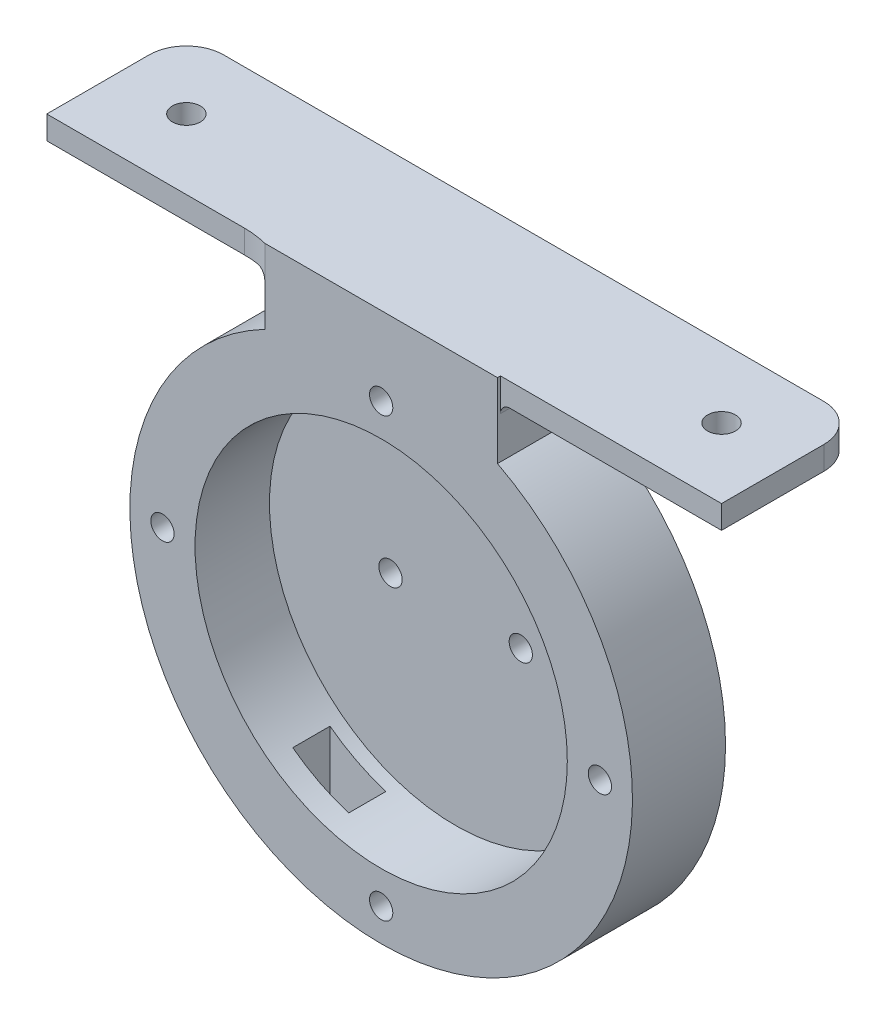
ISO-10303-21;
HEADER;
FILE_DESCRIPTION(('STEP AP214'),'2;1');
FILE_NAME('part.step','',(''),(''),'','','');
FILE_SCHEMA(('AUTOMOTIVE_DESIGN { 1 0 10303 214 1 1 1 1 }'));
ENDSEC;
DATA;
#1=APPLICATION_CONTEXT('core data for automotive mechanical design processes');
#2=APPLICATION_PROTOCOL_DEFINITION('international standard','automotive_design',2000,#1);
#3=PRODUCT_CONTEXT('',#1,'mechanical');
#4=PRODUCT('Part','Part','',(#3));
#5=PRODUCT_RELATED_PRODUCT_CATEGORY('part','',(#4));
#6=PRODUCT_DEFINITION_FORMATION('','',#4);
#7=PRODUCT_DEFINITION_CONTEXT('part definition',#1,'design');
#8=PRODUCT_DEFINITION('design','',#6,#7);
#9=PRODUCT_DEFINITION_SHAPE('','',#8);
#10=(LENGTH_UNIT() NAMED_UNIT(*) SI_UNIT(.MILLI.,.METRE.));
#11=(NAMED_UNIT(*) PLANE_ANGLE_UNIT() SI_UNIT($,.RADIAN.));
#12=(NAMED_UNIT(*) SI_UNIT($,.STERADIAN.) SOLID_ANGLE_UNIT());
#13=UNCERTAINTY_MEASURE_WITH_UNIT(LENGTH_MEASURE(1.E-05),#10,'distance_accuracy_value','');
#14=(GEOMETRIC_REPRESENTATION_CONTEXT(3) GLOBAL_UNCERTAINTY_ASSIGNED_CONTEXT((#13)) GLOBAL_UNIT_ASSIGNED_CONTEXT((#10,
#11,#12)) REPRESENTATION_CONTEXT('',''));
#15=CARTESIAN_POINT('',(0.,0.,0.));
#16=DIRECTION('',(0.,0.,1.));
#17=DIRECTION('',(1.,0.,0.));
#18=AXIS2_PLACEMENT_3D('',#15,#16,#17);
#19=CARTESIAN_POINT('',(-12.5,23.9321958875486,4.));
#20=DIRECTION('',(-1.,0.,0.));
#21=DIRECTION('',(0.,0.,1.));
#22=AXIS2_PLACEMENT_3D('',#19,#20,#21);
#23=PLANE('',#22);
#24=DIRECTION('',(0.,-1.,0.));
#25=VECTOR('',#24,1.);
#26=CARTESIAN_POINT('',(-12.5,23.9321958875486,10.));
#27=LINE('',#26,#25);
#28=CARTESIAN_POINT('',(-12.5,28.4321958875486,10.));
#29=VERTEX_POINT('',#28);
#30=CARTESIAN_POINT('',(-12.5,23.9321958875486,10.));
#31=VERTEX_POINT('',#30);
#32=EDGE_CURVE('E255',#29,#31,#27,.T.);
#33=ORIENTED_EDGE('',*,*,#32,.F.);
#34=DIRECTION('',(0.,0.,1.));
#35=VECTOR('',#34,1.);
#36=CARTESIAN_POINT('',(-12.5,28.4321958875486,4.));
#37=LINE('',#36,#35);
#38=CARTESIAN_POINT('',(-12.5,28.4321958875486,4.));
#39=VERTEX_POINT('',#38);
#40=EDGE_CURVE('E66',#29,#39,#37,.F.);
#41=ORIENTED_EDGE('',*,*,#40,.T.);
#42=DIRECTION('',(0.,-1.,0.));
#43=VECTOR('',#42,1.);
#44=CARTESIAN_POINT('',(-12.5,23.9321958875486,4.));
#45=LINE('',#44,#43);
#46=CARTESIAN_POINT('',(-12.5,23.9321958875486,4.));
#47=VERTEX_POINT('',#46);
#48=EDGE_CURVE('E275',#39,#47,#45,.T.);
#49=ORIENTED_EDGE('',*,*,#48,.T.);
#50=DIRECTION('',(0.,0.,1.));
#51=VECTOR('',#50,1.);
#52=CARTESIAN_POINT('',(-12.5,23.9321958875486,4.));
#53=LINE('',#52,#51);
#54=EDGE_CURVE('E281',#47,#31,#53,.T.);
#55=ORIENTED_EDGE('',*,*,#54,.T.);
#56=EDGE_LOOP('',(#33,#41,#49,#55));
#57=FACE_BOUND('',#56,.T.);
#58=ADVANCED_FACE('F41',(#57),#23,.T.);
#59=CARTESIAN_POINT('',(0.,0.,10.));
#60=DIRECTION('',(0.,0.,1.));
#61=DIRECTION('',(1.,0.,0.));
#62=AXIS2_PLACEMENT_3D('',#59,#60,#61);
#63=PLANE('',#62);
#64=DIRECTION('',(0.,1.,0.));
#65=VECTOR('',#64,1.);
#66=CARTESIAN_POINT('',(12.5,23.9321958875486,10.));
#67=LINE('',#66,#65);
#68=CARTESIAN_POINT('',(12.5,23.9321958875486,10.));
#69=VERTEX_POINT('',#68);
#70=CARTESIAN_POINT('',(12.5,31.9321958875486,10.));
#71=VERTEX_POINT('',#70);
#72=EDGE_CURVE('E283',#69,#71,#67,.T.);
#73=ORIENTED_EDGE('',*,*,#72,.T.);
#74=DIRECTION('',(-1.,0.,0.));
#75=VECTOR('',#74,1.);
#76=CARTESIAN_POINT('',(-12.5,31.9321958875486,10.));
#77=LINE('',#76,#75);
#78=CARTESIAN_POINT('',(-12.5,31.9321958875486,10.));
#79=VERTEX_POINT('',#78);
#80=EDGE_CURVE('E278',#71,#79,#77,.T.);
#81=ORIENTED_EDGE('',*,*,#80,.T.);
#82=EDGE_CURVE('E59',#79,#29,#27,.T.);
#83=ORIENTED_EDGE('',*,*,#82,.T.);
#84=ORIENTED_EDGE('',*,*,#32,.T.);
#85=CARTESIAN_POINT('',(0.,0.,10.));
#86=DIRECTION('',(0.,0.,1.));
#87=DIRECTION('',(1.,0.,0.));
#88=AXIS2_PLACEMENT_3D('',#85,#86,#87);
#89=CIRCLE('',#88,27.);
#90=EDGE_CURVE('E334',#31,#69,#89,.T.);
#91=ORIENTED_EDGE('',*,*,#90,.T.);
#92=EDGE_LOOP('',(#73,#81,#83,#84,#91));
#93=FACE_BOUND('',#92,.T.);
#94=CARTESIAN_POINT('',(1.327186583295E-12,-23.5,10.));
#95=DIRECTION('',(0.,0.,1.));
#96=DIRECTION('',(1.,0.,0.));
#97=AXIS2_PLACEMENT_3D('',#94,#95,#96);
#98=CIRCLE('',#97,1.25000000000143);
#99=CARTESIAN_POINT('',(1.25000000000276,-23.5,10.));
#100=VERTEX_POINT('',#99);
#101=EDGE_CURVE('E313',#100,#100,#98,.T.);
#102=ORIENTED_EDGE('',*,*,#101,.F.);
#103=EDGE_LOOP('',(#102));
#104=FACE_BOUND('',#103,.T.);
#105=CARTESIAN_POINT('',(0.,0.,10.));
#106=DIRECTION('',(0.,0.,1.));
#107=DIRECTION('',(1.,0.,0.));
#108=AXIS2_PLACEMENT_3D('',#105,#106,#107);
#109=CIRCLE('',#108,20.);
#110=CARTESIAN_POINT('',(20.,0.,10.));
#111=VERTEX_POINT('',#110);
#112=EDGE_CURVE('E322',#111,#111,#109,.T.);
#113=ORIENTED_EDGE('',*,*,#112,.F.);
#114=EDGE_LOOP('',(#113));
#115=FACE_BOUND('',#114,.T.);
#116=CARTESIAN_POINT('',(0.,23.5,10.));
#117=DIRECTION('',(0.,0.,1.));
#118=DIRECTION('',(1.,0.,0.));
#119=AXIS2_PLACEMENT_3D('',#116,#117,#118);
#120=CIRCLE('',#119,1.25);
#121=CARTESIAN_POINT('',(1.25,23.5,10.));
#122=VERTEX_POINT('',#121);
#123=EDGE_CURVE('E328',#122,#122,#120,.T.);
#124=ORIENTED_EDGE('',*,*,#123,.F.);
#125=EDGE_LOOP('',(#124));
#126=FACE_BOUND('',#125,.T.);
#127=CARTESIAN_POINT('',(23.5000000000007,6.635932916475E-13,10.));
#128=DIRECTION('',(0.,0.,1.));
#129=DIRECTION('',(1.,0.,0.));
#130=AXIS2_PLACEMENT_3D('',#127,#128,#129);
#131=CIRCLE('',#130,1.25000000000052);
#132=CARTESIAN_POINT('',(24.7500000000012,6.635932916475E-13,10.));
#133=VERTEX_POINT('',#132);
#134=EDGE_CURVE('E319',#133,#133,#131,.T.);
#135=ORIENTED_EDGE('',*,*,#134,.F.);
#136=EDGE_LOOP('',(#135));
#137=FACE_BOUND('',#136,.T.);
#138=CARTESIAN_POINT('',(-23.4999999999993,-6.66471211625496E-13,10.));
#139=DIRECTION('',(0.,0.,1.));
#140=DIRECTION('',(1.,0.,0.));
#141=AXIS2_PLACEMENT_3D('',#138,#139,#140);
#142=CIRCLE('',#141,1.25000000000107);
#143=CARTESIAN_POINT('',(-22.2499999999983,-6.66471211625496E-13,10.));
#144=VERTEX_POINT('',#143);
#145=EDGE_CURVE('E307',#144,#144,#142,.T.);
#146=ORIENTED_EDGE('',*,*,#145,.F.);
#147=EDGE_LOOP('',(#146));
#148=FACE_BOUND('',#147,.T.);
#149=ADVANCED_FACE('F401',(#93,#104,#115,#126,#137,#148),#63,.T.);
#150=CARTESIAN_POINT('',(0.,0.,0.));
#151=DIRECTION('',(0.,0.,1.));
#152=DIRECTION('',(1.,0.,0.));
#153=AXIS2_PLACEMENT_3D('',#150,#151,#152);
#154=PLANE('',#153);
#155=CARTESIAN_POINT('',(0.,0.,0.));
#156=DIRECTION('',(0.,0.,1.));
#157=DIRECTION('',(1.,0.,0.));
#158=AXIS2_PLACEMENT_3D('',#155,#156,#157);
#159=CIRCLE('',#158,27.);
#160=CARTESIAN_POINT('',(27.,0.,0.));
#161=VERTEX_POINT('',#160);
#162=EDGE_CURVE('E331',#161,#161,#159,.T.);
#163=ORIENTED_EDGE('',*,*,#162,.F.);
#164=EDGE_LOOP('',(#163));
#165=FACE_BOUND('',#164,.T.);
#166=CARTESIAN_POINT('',(0.,23.5,0.));
#167=DIRECTION('',(0.,0.,1.));
#168=DIRECTION('',(1.,0.,0.));
#169=AXIS2_PLACEMENT_3D('',#166,#167,#168);
#170=CIRCLE('',#169,1.25);
#171=CARTESIAN_POINT('',(1.25,23.5,0.));
#172=VERTEX_POINT('',#171);
#173=EDGE_CURVE('E327',#172,#172,#170,.T.);
#174=ORIENTED_EDGE('',*,*,#173,.T.);
#175=EDGE_LOOP('',(#174));
#176=FACE_BOUND('',#175,.T.);
#177=CARTESIAN_POINT('',(23.5000000000007,6.635932916475E-13,0.));
#178=DIRECTION('',(0.,0.,1.));
#179=DIRECTION('',(1.,0.,0.));
#180=AXIS2_PLACEMENT_3D('',#177,#178,#179);
#181=CIRCLE('',#180,1.25000000000052);
#182=CARTESIAN_POINT('',(24.7500000000012,6.635932916475E-13,0.));
#183=VERTEX_POINT('',#182);
#184=EDGE_CURVE('E316',#183,#183,#181,.T.);
#185=ORIENTED_EDGE('',*,*,#184,.T.);
#186=EDGE_LOOP('',(#185));
#187=FACE_BOUND('',#186,.T.);
#188=CARTESIAN_POINT('',(1.327186583295E-12,-23.5,0.));
#189=DIRECTION('',(0.,0.,1.));
#190=DIRECTION('',(1.,0.,0.));
#191=AXIS2_PLACEMENT_3D('',#188,#189,#190);
#192=CIRCLE('',#191,1.25000000000143);
#193=CARTESIAN_POINT('',(1.25000000000276,-23.5,0.));
#194=VERTEX_POINT('',#193);
#195=EDGE_CURVE('E310',#194,#194,#192,.T.);
#196=ORIENTED_EDGE('',*,*,#195,.T.);
#197=EDGE_LOOP('',(#196));
#198=FACE_BOUND('',#197,.T.);
#199=CARTESIAN_POINT('',(-23.4999999999993,-6.66471211625496E-13,0.));
#200=DIRECTION('',(0.,0.,1.));
#201=DIRECTION('',(1.,0.,0.));
#202=AXIS2_PLACEMENT_3D('',#199,#200,#201);
#203=CIRCLE('',#202,1.25000000000107);
#204=CARTESIAN_POINT('',(-22.2499999999983,-6.66471211625496E-13,0.));
#205=VERTEX_POINT('',#204);
#206=EDGE_CURVE('E304',#205,#205,#203,.T.);
#207=ORIENTED_EDGE('',*,*,#206,.T.);
#208=EDGE_LOOP('',(#207));
#209=FACE_BOUND('',#208,.T.);
#210=CARTESIAN_POINT('',(-7.,0.,0.));
#211=DIRECTION('',(0.,0.,1.));
#212=DIRECTION('',(1.,0.,0.));
#213=AXIS2_PLACEMENT_3D('',#210,#211,#212);
#214=CIRCLE('',#213,1.25);
#215=CARTESIAN_POINT('',(-5.75,0.,0.));
#216=VERTEX_POINT('',#215);
#217=EDGE_CURVE('E298',#216,#216,#214,.T.);
#218=ORIENTED_EDGE('',*,*,#217,.T.);
#219=EDGE_LOOP('',(#218));
#220=FACE_BOUND('',#219,.T.);
#221=CARTESIAN_POINT('',(7.,0.,0.));
#222=DIRECTION('',(0.,0.,1.));
#223=DIRECTION('',(1.,0.,0.));
#224=AXIS2_PLACEMENT_3D('',#221,#222,#223);
#225=CIRCLE('',#224,1.25);
#226=CARTESIAN_POINT('',(8.25,0.,0.));
#227=VERTEX_POINT('',#226);
#228=EDGE_CURVE('E289',#227,#227,#225,.T.);
#229=ORIENTED_EDGE('',*,*,#228,.T.);
#230=EDGE_LOOP('',(#229));
#231=FACE_BOUND('',#230,.T.);
#232=ADVANCED_FACE('F406',(#165,#176,#187,#198,#209,#220,#231),#154,.F.);
#233=CARTESIAN_POINT('',(0.,0.,10.));
#234=DIRECTION('',(0.,0.,-1.));
#235=DIRECTION('',(-1.,0.,0.));
#236=AXIS2_PLACEMENT_3D('',#233,#234,#235);
#237=CYLINDRICAL_SURFACE('',#236,27.);
#238=CARTESIAN_POINT('',(0.,0.,3.49999999999996));
#239=DIRECTION('',(0.,0.,-1.));
#240=DIRECTION('',(-1.,0.,0.));
#241=AXIS2_PLACEMENT_3D('',#238,#239,#240);
#242=CIRCLE('',#241,27.);
#243=CARTESIAN_POINT('',(-12.,-24.1867732448956,3.49999999999996));
#244=VERTEX_POINT('',#243);
#245=CARTESIAN_POINT('',(-6.,-26.3248931621764,3.49999999999996));
#246=VERTEX_POINT('',#245);
#247=EDGE_CURVE('E256',#244,#246,#242,.F.);
#248=ORIENTED_EDGE('',*,*,#247,.F.);
#249=DIRECTION('',(0.,0.,-1.));
#250=VECTOR('',#249,1.);
#251=CARTESIAN_POINT('',(-12.,-24.1867732448957,10.));
#252=LINE('',#251,#250);
#253=CARTESIAN_POINT('',(-12.,-24.1867732448957,7.49999999999996));
#254=VERTEX_POINT('',#253);
#255=EDGE_CURVE('E259',#254,#244,#252,.T.);
#256=ORIENTED_EDGE('',*,*,#255,.F.);
#257=CARTESIAN_POINT('',(0.,0.,7.49999999999996));
#258=DIRECTION('',(0.,0.,1.));
#259=DIRECTION('',(1.,0.,0.));
#260=AXIS2_PLACEMENT_3D('',#257,#258,#259);
#261=CIRCLE('',#260,27.);
#262=CARTESIAN_POINT('',(-6.,-26.3248931621764,7.49999999999996));
#263=VERTEX_POINT('',#262);
#264=EDGE_CURVE('E262',#263,#254,#261,.F.);
#265=ORIENTED_EDGE('',*,*,#264,.F.);
#266=DIRECTION('',(0.,0.,-1.));
#267=VECTOR('',#266,1.);
#268=CARTESIAN_POINT('',(-6.,-26.3248931621764,10.));
#269=LINE('',#268,#267);
#270=EDGE_CURVE('E253',#246,#263,#269,.F.);
#271=ORIENTED_EDGE('',*,*,#270,.F.);
#272=EDGE_LOOP('',(#248,#256,#265,#271));
#273=FACE_BOUND('',#272,.T.);
#274=CARTESIAN_POINT('',(0.,0.,4.));
#275=DIRECTION('',(0.,0.,-1.));
#276=DIRECTION('',(-1.,0.,0.));
#277=AXIS2_PLACEMENT_3D('',#274,#275,#276);
#278=CIRCLE('',#277,27.);
#279=CARTESIAN_POINT('',(12.5,23.9321958875486,4.));
#280=VERTEX_POINT('',#279);
#281=EDGE_CURVE('E342',#47,#280,#278,.T.);
#282=ORIENTED_EDGE('',*,*,#281,.T.);
#283=DIRECTION('',(0.,0.,1.));
#284=VECTOR('',#283,1.);
#285=CARTESIAN_POINT('',(12.5,23.9321958875486,4.));
#286=LINE('',#285,#284);
#287=EDGE_CURVE('E290',#280,#69,#286,.T.);
#288=ORIENTED_EDGE('',*,*,#287,.T.);
#289=ORIENTED_EDGE('',*,*,#90,.F.);
#290=ORIENTED_EDGE('',*,*,#54,.F.);
#291=EDGE_LOOP('',(#282,#288,#289,#290));
#292=FACE_BOUND('',#291,.T.);
#293=ORIENTED_EDGE('',*,*,#162,.T.);
#294=EDGE_LOOP('',(#293));
#295=FACE_BOUND('',#294,.T.);
#296=ADVANCED_FACE('F386',(#273,#292,#295),#237,.T.);
#297=CARTESIAN_POINT('',(0.,23.5,10.));
#298=DIRECTION('',(0.,0.,-1.));
#299=DIRECTION('',(-1.,0.,0.));
#300=AXIS2_PLACEMENT_3D('',#297,#298,#299);
#301=CYLINDRICAL_SURFACE('',#300,1.25);
#302=ORIENTED_EDGE('',*,*,#123,.T.);
#303=EDGE_LOOP('',(#302));
#304=FACE_BOUND('',#303,.T.);
#305=ORIENTED_EDGE('',*,*,#173,.F.);
#306=EDGE_LOOP('',(#305));
#307=FACE_BOUND('',#306,.T.);
#308=ADVANCED_FACE('F440',(#304,#307),#301,.F.);
#309=CARTESIAN_POINT('',(0.,0.,10.));
#310=DIRECTION('',(0.,0.,-1.));
#311=DIRECTION('',(-1.,0.,0.));
#312=AXIS2_PLACEMENT_3D('',#309,#310,#311);
#313=CYLINDRICAL_SURFACE('',#312,20.);
#314=DIRECTION('',(0.,0.,-1.));
#315=VECTOR('',#314,1.);
#316=CARTESIAN_POINT('',(-12.,-16.,10.));
#317=LINE('',#316,#315);
#318=CARTESIAN_POINT('',(-12.,-16.,3.49999999999996));
#319=VERTEX_POINT('',#318);
#320=CARTESIAN_POINT('',(-12.,-16.,7.49999999999996));
#321=VERTEX_POINT('',#320);
#322=EDGE_CURVE('E351',#319,#321,#317,.F.);
#323=ORIENTED_EDGE('',*,*,#322,.F.);
#324=CARTESIAN_POINT('',(0.,0.,3.49999999999996));
#325=DIRECTION('',(0.,0.,-1.));
#326=DIRECTION('',(-1.,0.,0.));
#327=AXIS2_PLACEMENT_3D('',#324,#325,#326);
#328=CIRCLE('',#327,20.);
#329=CARTESIAN_POINT('',(-6.,-19.0787840283389,3.49999999999996));
#330=VERTEX_POINT('',#329);
#331=EDGE_CURVE('E349',#330,#319,#328,.T.);
#332=ORIENTED_EDGE('',*,*,#331,.F.);
#333=DIRECTION('',(0.,0.,-1.));
#334=VECTOR('',#333,1.);
#335=CARTESIAN_POINT('',(-6.,-19.0787840283389,10.));
#336=LINE('',#335,#334);
#337=CARTESIAN_POINT('',(-6.,-19.0787840283389,7.49999999999996));
#338=VERTEX_POINT('',#337);
#339=EDGE_CURVE('E347',#338,#330,#336,.T.);
#340=ORIENTED_EDGE('',*,*,#339,.F.);
#341=CARTESIAN_POINT('',(0.,0.,7.49999999999996));
#342=DIRECTION('',(0.,0.,1.));
#343=DIRECTION('',(1.,0.,0.));
#344=AXIS2_PLACEMENT_3D('',#341,#342,#343);
#345=CIRCLE('',#344,20.);
#346=EDGE_CURVE('E345',#321,#338,#345,.T.);
#347=ORIENTED_EDGE('',*,*,#346,.F.);
#348=EDGE_LOOP('',(#323,#332,#340,#347));
#349=FACE_BOUND('',#348,.T.);
#350=CARTESIAN_POINT('',(0.,0.,2.));
#351=DIRECTION('',(0.,0.,1.));
#352=DIRECTION('',(1.,0.,0.));
#353=AXIS2_PLACEMENT_3D('',#350,#351,#352);
#354=CIRCLE('',#353,20.);
#355=CARTESIAN_POINT('',(20.,0.,2.));
#356=VERTEX_POINT('',#355);
#357=EDGE_CURVE('E337',#356,#356,#354,.T.);
#358=ORIENTED_EDGE('',*,*,#357,.F.);
#359=EDGE_LOOP('',(#358));
#360=FACE_BOUND('',#359,.T.);
#361=ORIENTED_EDGE('',*,*,#112,.T.);
#362=EDGE_LOOP('',(#361));
#363=FACE_BOUND('',#362,.T.);
#364=ADVANCED_FACE('F436',(#349,#360,#363),#313,.F.);
#365=CARTESIAN_POINT('',(23.5000000000007,6.635932916475E-13,10.));
#366=DIRECTION('',(0.,0.,-1.));
#367=DIRECTION('',(-1.,0.,0.));
#368=AXIS2_PLACEMENT_3D('',#365,#366,#367);
#369=CYLINDRICAL_SURFACE('',#368,1.25000000000052);
#370=ORIENTED_EDGE('',*,*,#134,.T.);
#371=EDGE_LOOP('',(#370));
#372=FACE_BOUND('',#371,.T.);
#373=ORIENTED_EDGE('',*,*,#184,.F.);
#374=EDGE_LOOP('',(#373));
#375=FACE_BOUND('',#374,.T.);
#376=ADVANCED_FACE('F432',(#372,#375),#369,.F.);
#377=CARTESIAN_POINT('',(1.327186583295E-12,-23.5,10.));
#378=DIRECTION('',(0.,0.,-1.));
#379=DIRECTION('',(-1.,0.,0.));
#380=AXIS2_PLACEMENT_3D('',#377,#378,#379);
#381=CYLINDRICAL_SURFACE('',#380,1.25000000000143);
#382=ORIENTED_EDGE('',*,*,#101,.T.);
#383=EDGE_LOOP('',(#382));
#384=FACE_BOUND('',#383,.T.);
#385=ORIENTED_EDGE('',*,*,#195,.F.);
#386=EDGE_LOOP('',(#385));
#387=FACE_BOUND('',#386,.T.);
#388=ADVANCED_FACE('F428',(#384,#387),#381,.F.);
#389=CARTESIAN_POINT('',(-23.4999999999993,-6.66471211625496E-13,10.));
#390=DIRECTION('',(0.,0.,-1.));
#391=DIRECTION('',(-1.,0.,0.));
#392=AXIS2_PLACEMENT_3D('',#389,#390,#391);
#393=CYLINDRICAL_SURFACE('',#392,1.25000000000107);
#394=ORIENTED_EDGE('',*,*,#145,.T.);
#395=EDGE_LOOP('',(#394));
#396=FACE_BOUND('',#395,.T.);
#397=ORIENTED_EDGE('',*,*,#206,.F.);
#398=EDGE_LOOP('',(#397));
#399=FACE_BOUND('',#398,.T.);
#400=ADVANCED_FACE('F424',(#396,#399),#393,.F.);
#401=CARTESIAN_POINT('',(0.,0.,2.));
#402=DIRECTION('',(0.,0.,1.));
#403=DIRECTION('',(1.,0.,0.));
#404=AXIS2_PLACEMENT_3D('',#401,#402,#403);
#405=PLANE('',#404);
#406=CARTESIAN_POINT('',(-7.,0.,2.));
#407=DIRECTION('',(0.,0.,1.));
#408=DIRECTION('',(1.,0.,0.));
#409=AXIS2_PLACEMENT_3D('',#406,#407,#408);
#410=CIRCLE('',#409,1.25);
#411=CARTESIAN_POINT('',(-5.75,0.,2.));
#412=VERTEX_POINT('',#411);
#413=EDGE_CURVE('E301',#412,#412,#410,.T.);
#414=ORIENTED_EDGE('',*,*,#413,.F.);
#415=EDGE_LOOP('',(#414));
#416=FACE_BOUND('',#415,.T.);
#417=ORIENTED_EDGE('',*,*,#357,.T.);
#418=EDGE_LOOP('',(#417));
#419=FACE_BOUND('',#418,.T.);
#420=CARTESIAN_POINT('',(7.,0.,2.));
#421=DIRECTION('',(0.,0.,1.));
#422=DIRECTION('',(1.,0.,0.));
#423=AXIS2_PLACEMENT_3D('',#420,#421,#422);
#424=CIRCLE('',#423,1.25);
#425=CARTESIAN_POINT('',(8.25,0.,2.));
#426=VERTEX_POINT('',#425);
#427=EDGE_CURVE('E295',#426,#426,#424,.T.);
#428=ORIENTED_EDGE('',*,*,#427,.F.);
#429=EDGE_LOOP('',(#428));
#430=FACE_BOUND('',#429,.T.);
#431=ADVANCED_FACE('F420',(#416,#419,#430),#405,.T.);
#432=CARTESIAN_POINT('',(-7.,0.,2.));
#433=DIRECTION('',(0.,0.,-1.));
#434=DIRECTION('',(-1.,0.,0.));
#435=AXIS2_PLACEMENT_3D('',#432,#433,#434);
#436=CYLINDRICAL_SURFACE('',#435,1.25);
#437=ORIENTED_EDGE('',*,*,#413,.T.);
#438=EDGE_LOOP('',(#437));
#439=FACE_BOUND('',#438,.T.);
#440=ORIENTED_EDGE('',*,*,#217,.F.);
#441=EDGE_LOOP('',(#440));
#442=FACE_BOUND('',#441,.T.);
#443=ADVANCED_FACE('F416',(#439,#442),#436,.F.);
#444=CARTESIAN_POINT('',(7.,0.,2.));
#445=DIRECTION('',(0.,0.,-1.));
#446=DIRECTION('',(-1.,0.,0.));
#447=AXIS2_PLACEMENT_3D('',#444,#445,#446);
#448=CYLINDRICAL_SURFACE('',#447,1.25);
#449=ORIENTED_EDGE('',*,*,#427,.T.);
#450=EDGE_LOOP('',(#449));
#451=FACE_BOUND('',#450,.T.);
#452=ORIENTED_EDGE('',*,*,#228,.F.);
#453=EDGE_LOOP('',(#452));
#454=FACE_BOUND('',#453,.T.);
#455=ADVANCED_FACE('F412',(#451,#454),#448,.F.);
#456=CARTESIAN_POINT('',(-12.5,31.9321958875486,4.));
#457=DIRECTION('',(0.,1.,0.));
#458=DIRECTION('',(0.,0.,1.));
#459=AXIS2_PLACEMENT_3D('',#456,#457,#458);
#460=PLANE('',#459);
#461=DIRECTION('',(-1.,0.,0.));
#462=VECTOR('',#461,1.);
#463=CARTESIAN_POINT('',(-12.5,31.9321958875486,-5.32));
#464=LINE('',#463,#462);
#465=CARTESIAN_POINT('',(32.25,31.9321958875486,-5.32));
#466=VERTEX_POINT('',#465);
#467=CARTESIAN_POINT('',(-32.25,31.9321958875486,-5.32));
#468=VERTEX_POINT('',#467);
#469=EDGE_CURVE('E188',#466,#468,#464,.T.);
#470=ORIENTED_EDGE('',*,*,#469,.T.);
#471=CARTESIAN_POINT('',(-32.25,31.9321958875486,-1.31999999999999));
#472=DIRECTION('',(0.,1.,0.));
#473=DIRECTION('',(0.,0.,1.));
#474=AXIS2_PLACEMENT_3D('',#471,#472,#473);
#475=CIRCLE('',#474,3.99999999999999);
#476=CARTESIAN_POINT('',(-36.25,31.9321958875486,-1.31999999999999));
#477=VERTEX_POINT('',#476);
#478=EDGE_CURVE('E239',#477,#468,#475,.F.);
#479=ORIENTED_EDGE('',*,*,#478,.F.);
#480=DIRECTION('',(0.,0.,1.));
#481=VECTOR('',#480,1.);
#482=CARTESIAN_POINT('',(-36.25,31.9321958875486,0.));
#483=LINE('',#482,#481);
#484=CARTESIAN_POINT('',(-36.25,31.9321958875486,9.68000000000001));
#485=VERTEX_POINT('',#484);
#486=EDGE_CURVE('E242',#477,#485,#483,.T.);
#487=ORIENTED_EDGE('',*,*,#486,.T.);
#488=DIRECTION('',(-1.,0.,0.));
#489=VECTOR('',#488,1.);
#490=CARTESIAN_POINT('',(0.,31.9321958875486,9.67999999999999));
#491=LINE('',#490,#489);
#492=CARTESIAN_POINT('',(-15.0095019426173,31.9321958875486,9.67999999999999));
#493=VERTEX_POINT('',#492);
#494=EDGE_CURVE('E229',#493,#485,#491,.T.);
#495=ORIENTED_EDGE('',*,*,#494,.F.);
#496=CARTESIAN_POINT('',(-15.0095019426173,31.9321958875486,19.68));
#497=DIRECTION('',(0.,1.,0.));
#498=DIRECTION('',(0.,0.,1.));
#499=AXIS2_PLACEMENT_3D('',#496,#497,#498);
#500=CIRCLE('',#499,10.);
#501=EDGE_CURVE('E357',#493,#79,#500,.F.);
#502=ORIENTED_EDGE('',*,*,#501,.T.);
#503=ORIENTED_EDGE('',*,*,#80,.F.);
#504=DIRECTION('',(0.,0.,1.));
#505=VECTOR('',#504,1.);
#506=CARTESIAN_POINT('',(12.5,31.9321958875486,4.));
#507=LINE('',#506,#505);
#508=CARTESIAN_POINT('',(12.5,31.9321958875486,9.68000000000001));
#509=VERTEX_POINT('',#508);
#510=EDGE_CURVE('E287',#509,#71,#507,.T.);
#511=ORIENTED_EDGE('',*,*,#510,.F.);
#512=DIRECTION('',(1.,0.,0.));
#513=VECTOR('',#512,1.);
#514=CARTESIAN_POINT('',(0.,31.9321958875486,9.67999999999999));
#515=LINE('',#514,#513);
#516=CARTESIAN_POINT('',(36.25,31.9321958875486,9.68000000000001));
#517=VERTEX_POINT('',#516);
#518=EDGE_CURVE('E216',#509,#517,#515,.T.);
#519=ORIENTED_EDGE('',*,*,#518,.T.);
#520=DIRECTION('',(0.,0.,1.));
#521=VECTOR('',#520,1.);
#522=CARTESIAN_POINT('',(36.25,31.9321958875486,0.));
#523=LINE('',#522,#521);
#524=CARTESIAN_POINT('',(36.25,31.9321958875486,-1.31999999999999));
#525=VERTEX_POINT('',#524);
#526=EDGE_CURVE('E207',#525,#517,#523,.T.);
#527=ORIENTED_EDGE('',*,*,#526,.F.);
#528=CARTESIAN_POINT('',(32.25,31.9321958875486,-1.31999999999999));
#529=DIRECTION('',(0.,-1.,0.));
#530=DIRECTION('',(0.,0.,1.));
#531=AXIS2_PLACEMENT_3D('',#528,#529,#530);
#532=CIRCLE('',#531,3.99999999999999);
#533=EDGE_CURVE('E214',#525,#466,#532,.F.);
#534=ORIENTED_EDGE('',*,*,#533,.T.);
#535=EDGE_LOOP('',(#470,#479,#487,#495,#502,#503,#511,#519,#527,#534));
#536=FACE_BOUND('',#535,.T.);
#537=CARTESIAN_POINT('',(-28.75,31.9321958875486,2.18));
#538=DIRECTION('',(0.,1.,0.));
#539=DIRECTION('',(0.,0.,1.));
#540=AXIS2_PLACEMENT_3D('',#537,#538,#539);
#541=CIRCLE('',#540,1.5);
#542=CARTESIAN_POINT('',(-28.75,31.9321958875486,3.68));
#543=VERTEX_POINT('',#542);
#544=EDGE_CURVE('E222',#543,#543,#541,.T.);
#545=ORIENTED_EDGE('',*,*,#544,.F.);
#546=EDGE_LOOP('',(#545));
#547=FACE_BOUND('',#546,.T.);
#548=CARTESIAN_POINT('',(28.75,31.9321958875486,2.18));
#549=DIRECTION('',(0.,-1.,0.));
#550=DIRECTION('',(0.,0.,1.));
#551=AXIS2_PLACEMENT_3D('',#548,#549,#550);
#552=CIRCLE('',#551,1.5);
#553=CARTESIAN_POINT('',(28.75,31.9321958875486,3.68));
#554=VERTEX_POINT('',#553);
#555=EDGE_CURVE('E211',#554,#554,#552,.T.);
#556=ORIENTED_EDGE('',*,*,#555,.T.);
#557=EDGE_LOOP('',(#556));
#558=FACE_BOUND('',#557,.T.);
#559=ADVANCED_FACE('F415',(#536,#547,#558),#460,.T.);
#560=CARTESIAN_POINT('',(12.5,23.9321958875486,4.));
#561=DIRECTION('',(1.,0.,0.));
#562=DIRECTION('',(0.,0.,-1.));
#563=AXIS2_PLACEMENT_3D('',#560,#561,#562);
#564=PLANE('',#563);
#565=DIRECTION('',(0.,1.,0.));
#566=VECTOR('',#565,1.);
#567=CARTESIAN_POINT('',(12.5,23.9321958875486,4.));
#568=LINE('',#567,#566);
#569=CARTESIAN_POINT('',(12.5,28.4321958875486,4.));
#570=VERTEX_POINT('',#569);
#571=EDGE_CURVE('E277',#280,#570,#568,.T.);
#572=ORIENTED_EDGE('',*,*,#571,.T.);
#573=DIRECTION('',(0.,0.,1.));
#574=VECTOR('',#573,1.);
#575=CARTESIAN_POINT('',(12.5,28.4321958875486,9.68000000000001));
#576=LINE('',#575,#574);
#577=CARTESIAN_POINT('',(12.5,28.4321958875486,9.68));
#578=VERTEX_POINT('',#577);
#579=EDGE_CURVE('E361',#570,#578,#576,.T.);
#580=ORIENTED_EDGE('',*,*,#579,.T.);
#581=DIRECTION('',(0.,1.,0.));
#582=VECTOR('',#581,1.);
#583=CARTESIAN_POINT('',(12.5,29.4321958875486,9.68));
#584=LINE('',#583,#582);
#585=EDGE_CURVE('E196',#578,#509,#584,.T.);
#586=ORIENTED_EDGE('',*,*,#585,.T.);
#587=ORIENTED_EDGE('',*,*,#510,.T.);
#588=ORIENTED_EDGE('',*,*,#72,.F.);
#589=ORIENTED_EDGE('',*,*,#287,.F.);
#590=EDGE_LOOP('',(#572,#580,#586,#587,#588,#589));
#591=FACE_BOUND('',#590,.T.);
#592=ADVANCED_FACE('F410',(#591),#564,.T.);
#593=CARTESIAN_POINT('',(0.,0.,4.));
#594=DIRECTION('',(0.,0.,-1.));
#595=DIRECTION('',(-1.,0.,0.));
#596=AXIS2_PLACEMENT_3D('',#593,#594,#595);
#597=PLANE('',#596);
#598=ORIENTED_EDGE('',*,*,#48,.F.);
#599=DIRECTION('',(-1.,0.,0.));
#600=VECTOR('',#599,1.);
#601=CARTESIAN_POINT('',(12.5,28.4321958875486,4.));
#602=LINE('',#601,#600);
#603=EDGE_CURVE('E370',#39,#570,#602,.F.);
#604=ORIENTED_EDGE('',*,*,#603,.T.);
#605=ORIENTED_EDGE('',*,*,#571,.F.);
#606=ORIENTED_EDGE('',*,*,#281,.F.);
#607=EDGE_LOOP('',(#598,#604,#605,#606));
#608=FACE_BOUND('',#607,.T.);
#609=ADVANCED_FACE('F481',(#608),#597,.T.);
#610=CARTESIAN_POINT('',(-12.,-27.001,3.49999999999996));
#611=DIRECTION('',(-1.,0.,0.));
#612=DIRECTION('',(0.,0.,1.));
#613=AXIS2_PLACEMENT_3D('',#610,#611,#612);
#614=PLANE('',#613);
#615=ORIENTED_EDGE('',*,*,#322,.T.);
#616=DIRECTION('',(0.,1.,0.));
#617=VECTOR('',#616,1.);
#618=CARTESIAN_POINT('',(-12.,-27.001,7.49999999999996));
#619=LINE('',#618,#617);
#620=EDGE_CURVE('E187',#254,#321,#619,.T.);
#621=ORIENTED_EDGE('',*,*,#620,.F.);
#622=ORIENTED_EDGE('',*,*,#255,.T.);
#623=DIRECTION('',(0.,1.,0.));
#624=VECTOR('',#623,1.);
#625=CARTESIAN_POINT('',(-12.,-27.001,3.49999999999996));
#626=LINE('',#625,#624);
#627=EDGE_CURVE('E266',#244,#319,#626,.T.);
#628=ORIENTED_EDGE('',*,*,#627,.T.);
#629=EDGE_LOOP('',(#615,#621,#622,#628));
#630=FACE_BOUND('',#629,.T.);
#631=ADVANCED_FACE('F544',(#630),#614,.F.);
#632=CARTESIAN_POINT('',(-12.,-27.001,3.49999999999996));
#633=DIRECTION('',(0.,0.,-1.));
#634=DIRECTION('',(-1.,0.,0.));
#635=AXIS2_PLACEMENT_3D('',#632,#633,#634);
#636=PLANE('',#635);
#637=ORIENTED_EDGE('',*,*,#331,.T.);
#638=ORIENTED_EDGE('',*,*,#627,.F.);
#639=ORIENTED_EDGE('',*,*,#247,.T.);
#640=DIRECTION('',(0.,1.,0.));
#641=VECTOR('',#640,1.);
#642=CARTESIAN_POINT('',(-6.,-27.001,3.49999999999996));
#643=LINE('',#642,#641);
#644=EDGE_CURVE('E269',#246,#330,#643,.T.);
#645=ORIENTED_EDGE('',*,*,#644,.T.);
#646=EDGE_LOOP('',(#637,#638,#639,#645));
#647=FACE_BOUND('',#646,.T.);
#648=ADVANCED_FACE('F540',(#647),#636,.F.);
#649=CARTESIAN_POINT('',(-6.,-27.001,3.49999999999996));
#650=DIRECTION('',(1.,0.,0.));
#651=DIRECTION('',(0.,0.,-1.));
#652=AXIS2_PLACEMENT_3D('',#649,#650,#651);
#653=PLANE('',#652);
#654=ORIENTED_EDGE('',*,*,#339,.T.);
#655=ORIENTED_EDGE('',*,*,#644,.F.);
#656=ORIENTED_EDGE('',*,*,#270,.T.);
#657=DIRECTION('',(0.,1.,0.));
#658=VECTOR('',#657,1.);
#659=CARTESIAN_POINT('',(-6.,-27.001,7.49999999999996));
#660=LINE('',#659,#658);
#661=EDGE_CURVE('E265',#263,#338,#660,.T.);
#662=ORIENTED_EDGE('',*,*,#661,.T.);
#663=EDGE_LOOP('',(#654,#655,#656,#662));
#664=FACE_BOUND('',#663,.T.);
#665=ADVANCED_FACE('F536',(#664),#653,.F.);
#666=CARTESIAN_POINT('',(-12.,-27.001,7.49999999999996));
#667=DIRECTION('',(0.,0.,1.));
#668=DIRECTION('',(1.,0.,0.));
#669=AXIS2_PLACEMENT_3D('',#666,#667,#668);
#670=PLANE('',#669);
#671=ORIENTED_EDGE('',*,*,#346,.T.);
#672=ORIENTED_EDGE('',*,*,#661,.F.);
#673=ORIENTED_EDGE('',*,*,#264,.T.);
#674=ORIENTED_EDGE('',*,*,#620,.T.);
#675=EDGE_LOOP('',(#671,#672,#673,#674));
#676=FACE_BOUND('',#675,.T.);
#677=ADVANCED_FACE('F533',(#676),#670,.F.);
#678=CARTESIAN_POINT('',(-12.5,29.4321958875486,-5.32));
#679=DIRECTION('',(0.,0.,-1.));
#680=DIRECTION('',(-1.,0.,0.));
#681=AXIS2_PLACEMENT_3D('',#678,#679,#680);
#682=PLANE('',#681);
#683=DIRECTION('',(-1.,0.,0.));
#684=VECTOR('',#683,1.);
#685=CARTESIAN_POINT('',(-12.5,29.4321958875486,-5.32));
#686=LINE('',#685,#684);
#687=CARTESIAN_POINT('',(32.25,29.4321958875486,-5.32));
#688=VERTEX_POINT('',#687);
#689=CARTESIAN_POINT('',(-32.25,29.4321958875486,-5.32));
#690=VERTEX_POINT('',#689);
#691=EDGE_CURVE('E173',#688,#690,#686,.T.);
#692=ORIENTED_EDGE('',*,*,#691,.T.);
#693=DIRECTION('',(0.,1.,0.));
#694=VECTOR('',#693,1.);
#695=CARTESIAN_POINT('',(-32.25,29.4321958875486,-5.32));
#696=LINE('',#695,#694);
#697=EDGE_CURVE('E246',#690,#468,#696,.T.);
#698=ORIENTED_EDGE('',*,*,#697,.T.);
#699=ORIENTED_EDGE('',*,*,#469,.F.);
#700=DIRECTION('',(0.,1.,0.));
#701=VECTOR('',#700,1.);
#702=CARTESIAN_POINT('',(32.25,29.4321958875486,-5.32));
#703=LINE('',#702,#701);
#704=EDGE_CURVE('E191',#688,#466,#703,.T.);
#705=ORIENTED_EDGE('',*,*,#704,.F.);
#706=EDGE_LOOP('',(#692,#698,#699,#705));
#707=FACE_BOUND('',#706,.T.);
#708=ADVANCED_FACE('F192',(#707),#682,.T.);
#709=CARTESIAN_POINT('',(0.,29.4321958875486,0.));
#710=DIRECTION('',(0.,-1.,0.));
#711=DIRECTION('',(0.,0.,-1.));
#712=AXIS2_PLACEMENT_3D('',#709,#710,#711);
#713=PLANE('',#712);
#714=DIRECTION('',(1.,0.,0.));
#715=VECTOR('',#714,1.);
#716=CARTESIAN_POINT('',(0.,29.4321958875486,9.67999999999999));
#717=LINE('',#716,#715);
#718=CARTESIAN_POINT('',(13.5,29.4321958875486,9.67999999999999));
#719=VERTEX_POINT('',#718);
#720=CARTESIAN_POINT('',(36.25,29.4321958875486,9.68000000000001));
#721=VERTEX_POINT('',#720);
#722=EDGE_CURVE('E202',#719,#721,#717,.T.);
#723=ORIENTED_EDGE('',*,*,#722,.F.);
#724=DIRECTION('',(0.,0.,1.));
#725=VECTOR('',#724,1.);
#726=CARTESIAN_POINT('',(13.5,29.4321958875486,4.));
#727=LINE('',#726,#725);
#728=CARTESIAN_POINT('',(13.5,29.4321958875486,3.));
#729=VERTEX_POINT('',#728);
#730=EDGE_CURVE('E368',#719,#729,#727,.F.);
#731=ORIENTED_EDGE('',*,*,#730,.T.);
#732=DIRECTION('',(-1.,0.,0.));
#733=VECTOR('',#732,1.);
#734=CARTESIAN_POINT('',(-12.5,29.4321958875486,3.));
#735=LINE('',#734,#733);
#736=CARTESIAN_POINT('',(-13.5,29.4321958875486,3.));
#737=VERTEX_POINT('',#736);
#738=EDGE_CURVE('E366',#729,#737,#735,.T.);
#739=ORIENTED_EDGE('',*,*,#738,.T.);
#740=DIRECTION('',(0.,0.,1.));
#741=VECTOR('',#740,1.);
#742=CARTESIAN_POINT('',(-13.5,29.4321958875486,10.));
#743=LINE('',#742,#741);
#744=CARTESIAN_POINT('',(-13.5,29.4321958875486,9.79458630682384));
#745=VERTEX_POINT('',#744);
#746=EDGE_CURVE('E364',#737,#745,#743,.T.);
#747=ORIENTED_EDGE('',*,*,#746,.T.);
#748=CARTESIAN_POINT('',(-15.0095019426173,29.4321958875486,19.68));
#749=DIRECTION('',(0.,-1.,0.));
#750=DIRECTION('',(0.,0.,-1.));
#751=AXIS2_PLACEMENT_3D('',#748,#749,#750);
#752=CIRCLE('',#751,10.);
#753=CARTESIAN_POINT('',(-15.0095019426173,29.4321958875486,9.67999999999999));
#754=VERTEX_POINT('',#753);
#755=EDGE_CURVE('E359',#745,#754,#752,.F.);
#756=ORIENTED_EDGE('',*,*,#755,.T.);
#757=DIRECTION('',(-1.,0.,0.));
#758=VECTOR('',#757,1.);
#759=CARTESIAN_POINT('',(0.,29.4321958875486,9.67999999999999));
#760=LINE('',#759,#758);
#761=CARTESIAN_POINT('',(-36.25,29.4321958875486,9.68000000000001));
#762=VERTEX_POINT('',#761);
#763=EDGE_CURVE('E234',#754,#762,#760,.T.);
#764=ORIENTED_EDGE('',*,*,#763,.T.);
#765=DIRECTION('',(0.,0.,1.));
#766=VECTOR('',#765,1.);
#767=CARTESIAN_POINT('',(-36.25,29.4321958875486,0.));
#768=LINE('',#767,#766);
#769=CARTESIAN_POINT('',(-36.25,29.4321958875486,-1.31999999999999));
#770=VERTEX_POINT('',#769);
#771=EDGE_CURVE('E231',#770,#762,#768,.T.);
#772=ORIENTED_EDGE('',*,*,#771,.F.);
#773=CARTESIAN_POINT('',(-32.25,29.4321958875486,-1.31999999999999));
#774=DIRECTION('',(0.,1.,0.));
#775=DIRECTION('',(0.,0.,1.));
#776=AXIS2_PLACEMENT_3D('',#773,#774,#775);
#777=CIRCLE('',#776,3.99999999999999);
#778=EDGE_CURVE('E183',#770,#690,#777,.F.);
#779=ORIENTED_EDGE('',*,*,#778,.T.);
#780=ORIENTED_EDGE('',*,*,#691,.F.);
#781=CARTESIAN_POINT('',(32.25,29.4321958875486,-1.31999999999999));
#782=DIRECTION('',(0.,-1.,0.));
#783=DIRECTION('',(0.,0.,1.));
#784=AXIS2_PLACEMENT_3D('',#781,#782,#783);
#785=CIRCLE('',#784,3.99999999999999);
#786=CARTESIAN_POINT('',(36.25,29.4321958875486,-1.31999999999999));
#787=VERTEX_POINT('',#786);
#788=EDGE_CURVE('E180',#787,#688,#785,.F.);
#789=ORIENTED_EDGE('',*,*,#788,.F.);
#790=DIRECTION('',(0.,0.,1.));
#791=VECTOR('',#790,1.);
#792=CARTESIAN_POINT('',(36.25,29.4321958875486,0.));
#793=LINE('',#792,#791);
#794=EDGE_CURVE('E197',#787,#721,#793,.T.);
#795=ORIENTED_EDGE('',*,*,#794,.T.);
#796=EDGE_LOOP('',(#723,#731,#739,#747,#756,#764,#772,#779,#780,#789,#795));
#797=FACE_BOUND('',#796,.T.);
#798=CARTESIAN_POINT('',(-28.75,29.4321958875486,2.18));
#799=DIRECTION('',(0.,1.,0.));
#800=DIRECTION('',(0.,0.,1.));
#801=AXIS2_PLACEMENT_3D('',#798,#799,#800);
#802=CIRCLE('',#801,1.5);
#803=CARTESIAN_POINT('',(-28.75,29.4321958875486,3.68));
#804=VERTEX_POINT('',#803);
#805=EDGE_CURVE('E226',#804,#804,#802,.T.);
#806=ORIENTED_EDGE('',*,*,#805,.T.);
#807=EDGE_LOOP('',(#806));
#808=FACE_BOUND('',#807,.T.);
#809=CARTESIAN_POINT('',(28.75,29.4321958875486,2.18));
#810=DIRECTION('',(0.,-1.,0.));
#811=DIRECTION('',(0.,0.,1.));
#812=AXIS2_PLACEMENT_3D('',#809,#810,#811);
#813=CIRCLE('',#812,1.5);
#814=CARTESIAN_POINT('',(28.75,29.4321958875486,3.68));
#815=VERTEX_POINT('',#814);
#816=EDGE_CURVE('E203',#815,#815,#813,.T.);
#817=ORIENTED_EDGE('',*,*,#816,.F.);
#818=EDGE_LOOP('',(#817));
#819=FACE_BOUND('',#818,.T.);
#820=ADVANCED_FACE('F176',(#797,#808,#819),#713,.T.);
#821=CARTESIAN_POINT('',(-32.25,29.4321958875486,-1.31999999999999));
#822=DIRECTION('',(0.,1.,0.));
#823=DIRECTION('',(0.,0.,1.));
#824=AXIS2_PLACEMENT_3D('',#821,#822,#823);
#825=CYLINDRICAL_SURFACE('',#824,3.99999999999999);
#826=ORIENTED_EDGE('',*,*,#478,.T.);
#827=ORIENTED_EDGE('',*,*,#697,.F.);
#828=ORIENTED_EDGE('',*,*,#778,.F.);
#829=DIRECTION('',(0.,1.,0.));
#830=VECTOR('',#829,1.);
#831=CARTESIAN_POINT('',(-36.25,29.4321958875486,-1.31999999999999));
#832=LINE('',#831,#830);
#833=EDGE_CURVE('E236',#770,#477,#832,.T.);
#834=ORIENTED_EDGE('',*,*,#833,.T.);
#835=EDGE_LOOP('',(#826,#827,#828,#834));
#836=FACE_BOUND('',#835,.T.);
#837=ADVANCED_FACE('F516',(#836),#825,.T.);
#838=CARTESIAN_POINT('',(0.,29.4321958875486,9.67999999999999));
#839=DIRECTION('',(0.,0.,-1.));
#840=DIRECTION('',(-1.,0.,0.));
#841=AXIS2_PLACEMENT_3D('',#838,#839,#840);
#842=PLANE('',#841);
#843=ORIENTED_EDGE('',*,*,#763,.F.);
#844=DIRECTION('',(0.,1.,0.));
#845=VECTOR('',#844,1.);
#846=CARTESIAN_POINT('',(-15.0095019426173,29.4321958875486,9.67999999999999));
#847=LINE('',#846,#845);
#848=EDGE_CURVE('E354',#754,#493,#847,.T.);
#849=ORIENTED_EDGE('',*,*,#848,.T.);
#850=ORIENTED_EDGE('',*,*,#494,.T.);
#851=DIRECTION('',(0.,1.,0.));
#852=VECTOR('',#851,1.);
#853=CARTESIAN_POINT('',(-36.25,29.4321958875486,9.68000000000001));
#854=LINE('',#853,#852);
#855=EDGE_CURVE('E248',#762,#485,#854,.T.);
#856=ORIENTED_EDGE('',*,*,#855,.F.);
#857=EDGE_LOOP('',(#843,#849,#850,#856));
#858=FACE_BOUND('',#857,.T.);
#859=ADVANCED_FACE('F510',(#858),#842,.F.);
#860=CARTESIAN_POINT('',(-28.75,29.4321958875486,2.18));
#861=DIRECTION('',(0.,1.,0.));
#862=DIRECTION('',(0.,0.,1.));
#863=AXIS2_PLACEMENT_3D('',#860,#861,#862);
#864=CYLINDRICAL_SURFACE('',#863,1.5);
#865=ORIENTED_EDGE('',*,*,#805,.F.);
#866=EDGE_LOOP('',(#865));
#867=FACE_BOUND('',#866,.T.);
#868=ORIENTED_EDGE('',*,*,#544,.T.);
#869=EDGE_LOOP('',(#868));
#870=FACE_BOUND('',#869,.T.);
#871=ADVANCED_FACE('F523',(#867,#870),#864,.F.);
#872=CARTESIAN_POINT('',(-36.25,29.4321958875486,0.));
#873=DIRECTION('',(-1.,0.,0.));
#874=DIRECTION('',(0.,0.,1.));
#875=AXIS2_PLACEMENT_3D('',#872,#873,#874);
#876=PLANE('',#875);
#877=ORIENTED_EDGE('',*,*,#486,.F.);
#878=ORIENTED_EDGE('',*,*,#833,.F.);
#879=ORIENTED_EDGE('',*,*,#771,.T.);
#880=ORIENTED_EDGE('',*,*,#855,.T.);
#881=EDGE_LOOP('',(#877,#878,#879,#880));
#882=FACE_BOUND('',#881,.T.);
#883=ADVANCED_FACE('F384',(#882),#876,.T.);
#884=CARTESIAN_POINT('',(-15.0095019426173,23.9321958875486,19.68));
#885=DIRECTION('',(0.,1.,0.));
#886=DIRECTION('',(0.,0.,1.));
#887=AXIS2_PLACEMENT_3D('',#884,#885,#886);
#888=CYLINDRICAL_SURFACE('',#887,10.);
#889=ORIENTED_EDGE('',*,*,#755,.F.);
#890=CARTESIAN_POINT('',(-13.5,29.4321958875486,9.79458630682384));
#891=CARTESIAN_POINT('',(-13.4428521125207,29.43223867927,9.80329351578383));
#892=CARTESIAN_POINT('',(-13.3858113291251,29.4273002432876,9.81252942126494));
#893=CARTESIAN_POINT('',(-13.2735477466419,29.4078689944747,9.83167013974748));
#894=CARTESIAN_POINT('',(-13.218323342909,29.3933848663532,9.84157433738882));
#895=CARTESIAN_POINT('',(-13.1111764067432,29.3552652288896,9.86168230961862));
#896=CARTESIAN_POINT('',(-13.0592545179267,29.3316279420412,9.87188614203901));
#897=CARTESIAN_POINT('',(-12.9601474995297,29.2758724346307,9.89211465118245));
#898=CARTESIAN_POINT('',(-12.912962176906,29.2437545598965,9.90213933519314));
#899=CARTESIAN_POINT('',(-12.8244777290642,29.1717471594091,9.92153015054947));
#900=CARTESIAN_POINT('',(-12.7832016761859,29.1318285369182,9.93089363188135));
#901=CARTESIAN_POINT('',(-12.7079641575582,29.0453539520598,9.94838044269153));
#902=CARTESIAN_POINT('',(-12.6740035432356,28.9987972181448,9.95650362778263));
#903=CARTESIAN_POINT('',(-12.6149136517958,28.9010636718768,9.97088769523841));
#904=CARTESIAN_POINT('',(-12.5896632043876,28.8499638341685,9.97717392619067));
#905=CARTESIAN_POINT('',(-12.5481727714773,28.744047814809,9.98761532910275));
#906=CARTESIAN_POINT('',(-12.5319238609595,28.6892353749502,9.99177261160268));
#907=CARTESIAN_POINT('',(-12.513658405148,28.6003448697577,9.99646693670646));
#908=CARTESIAN_POINT('',(-12.5085406190355,28.5669143180933,9.99778883392075));
#909=CARTESIAN_POINT('',(-12.5017118644126,28.4997268574924,9.99955614431458));
#910=CARTESIAN_POINT('',(-12.4999966236265,28.4659704113661,10.0000026566294));
#911=CARTESIAN_POINT('',(-12.5,28.4321958875486,10.));
#912=B_SPLINE_CURVE_WITH_KNOTS('',3,(#890,#891,#892,#893,#894,#895,#896,#897,#898,#899,#900,
#901,#902,#903,#904,#905,#906,#907,#908,#909,#910,#911),.UNSPECIFIED.,.F.,.F.,(4,2,2,2,2,2,2,2,
2,2,4),(0.,0.173172166740786,0.346186997845676,0.519235444591118,0.692276835722738,
0.865976433459569,1.0396962367785,1.21089143167924,1.38191658150379,1.48328598805993,
1.58452803323841),.UNSPECIFIED.);
#913=EDGE_CURVE('E12',#745,#29,#912,.T.);
#914=ORIENTED_EDGE('',*,*,#913,.T.);
#915=ORIENTED_EDGE('',*,*,#82,.F.);
#916=ORIENTED_EDGE('',*,*,#501,.F.);
#917=ORIENTED_EDGE('',*,*,#848,.F.);
#918=EDGE_LOOP('',(#889,#914,#915,#916,#917));
#919=FACE_BOUND('',#918,.T.);
#920=ADVANCED_FACE('F379',(#919),#888,.F.);
#921=CARTESIAN_POINT('',(32.25,29.4321958875486,-1.31999999999999));
#922=DIRECTION('',(0.,1.,0.));
#923=DIRECTION('',(0.,0.,1.));
#924=AXIS2_PLACEMENT_3D('',#921,#922,#923);
#925=CYLINDRICAL_SURFACE('',#924,3.99999999999999);
#926=ORIENTED_EDGE('',*,*,#533,.F.);
#927=DIRECTION('',(0.,1.,0.));
#928=VECTOR('',#927,1.);
#929=CARTESIAN_POINT('',(36.25,29.4321958875486,-1.31999999999999));
#930=LINE('',#929,#928);
#931=EDGE_CURVE('E200',#787,#525,#930,.T.);
#932=ORIENTED_EDGE('',*,*,#931,.F.);
#933=ORIENTED_EDGE('',*,*,#788,.T.);
#934=ORIENTED_EDGE('',*,*,#704,.T.);
#935=EDGE_LOOP('',(#926,#932,#933,#934));
#936=FACE_BOUND('',#935,.T.);
#937=ADVANCED_FACE('F199',(#936),#925,.T.);
#938=CARTESIAN_POINT('',(36.25,29.4321958875486,0.));
#939=DIRECTION('',(-1.,0.,0.));
#940=DIRECTION('',(0.,0.,1.));
#941=AXIS2_PLACEMENT_3D('',#938,#939,#940);
#942=PLANE('',#941);
#943=ORIENTED_EDGE('',*,*,#526,.T.);
#944=DIRECTION('',(0.,1.,0.));
#945=VECTOR('',#944,1.);
#946=CARTESIAN_POINT('',(36.25,29.4321958875486,9.68000000000001));
#947=LINE('',#946,#945);
#948=EDGE_CURVE('E223',#721,#517,#947,.T.);
#949=ORIENTED_EDGE('',*,*,#948,.F.);
#950=ORIENTED_EDGE('',*,*,#794,.F.);
#951=ORIENTED_EDGE('',*,*,#931,.T.);
#952=EDGE_LOOP('',(#943,#949,#950,#951));
#953=FACE_BOUND('',#952,.T.);
#954=ADVANCED_FACE('F496',(#953),#942,.F.);
#955=CARTESIAN_POINT('',(0.,29.4321958875486,9.67999999999999));
#956=DIRECTION('',(0.,0.,1.));
#957=DIRECTION('',(1.,0.,0.));
#958=AXIS2_PLACEMENT_3D('',#955,#956,#957);
#959=PLANE('',#958);
#960=ORIENTED_EDGE('',*,*,#518,.F.);
#961=ORIENTED_EDGE('',*,*,#585,.F.);
#962=CARTESIAN_POINT('',(13.5,28.4321958875486,9.67999999999999));
#963=DIRECTION('',(0.,0.,1.));
#964=DIRECTION('',(1.,0.,0.));
#965=AXIS2_PLACEMENT_3D('',#962,#963,#964);
#966=CIRCLE('',#965,1.);
#967=EDGE_CURVE('E51',#578,#719,#966,.F.);
#968=ORIENTED_EDGE('',*,*,#967,.T.);
#969=ORIENTED_EDGE('',*,*,#722,.T.);
#970=ORIENTED_EDGE('',*,*,#948,.T.);
#971=EDGE_LOOP('',(#960,#961,#968,#969,#970));
#972=FACE_BOUND('',#971,.T.);
#973=ADVANCED_FACE('F493',(#972),#959,.T.);
#974=CARTESIAN_POINT('',(28.75,29.4321958875486,2.18));
#975=DIRECTION('',(0.,1.,0.));
#976=DIRECTION('',(0.,0.,1.));
#977=AXIS2_PLACEMENT_3D('',#974,#975,#976);
#978=CYLINDRICAL_SURFACE('',#977,1.5);
#979=ORIENTED_EDGE('',*,*,#816,.T.);
#980=EDGE_LOOP('',(#979));
#981=FACE_BOUND('',#980,.T.);
#982=ORIENTED_EDGE('',*,*,#555,.F.);
#983=EDGE_LOOP('',(#982));
#984=FACE_BOUND('',#983,.T.);
#985=ADVANCED_FACE('F397',(#981,#984),#978,.F.);
#986=CARTESIAN_POINT('',(-13.5,28.4321958875486,0.));
#987=DIRECTION('',(0.,0.,-1.));
#988=DIRECTION('',(-1.,0.,0.));
#989=AXIS2_PLACEMENT_3D('',#986,#987,#988);
#990=CYLINDRICAL_SURFACE('',#989,1.);
#991=ORIENTED_EDGE('',*,*,#913,.F.);
#992=ORIENTED_EDGE('',*,*,#746,.F.);
#993=CARTESIAN_POINT('',(-13.5,28.4321958875486,3.));
#994=DIRECTION('',(0.707106781186547,0.,-0.707106781186547));
#995=DIRECTION('',(-0.707106781186547,0.,-0.707106781186547));
#996=AXIS2_PLACEMENT_3D('',#993,#994,#995);
#997=ELLIPSE('',#996,1.41421356237309,1.);
#998=EDGE_CURVE('E46',#39,#737,#997,.F.);
#999=ORIENTED_EDGE('',*,*,#998,.F.);
#1000=ORIENTED_EDGE('',*,*,#40,.F.);
#1001=EDGE_LOOP('',(#991,#992,#999,#1000));
#1002=FACE_BOUND('',#1001,.T.);
#1003=ADVANCED_FACE('F43',(#1002),#990,.F.);
#1004=CARTESIAN_POINT('',(0.,28.4321958875486,3.));
#1005=DIRECTION('',(1.,0.,0.));
#1006=DIRECTION('',(0.,0.,-1.));
#1007=AXIS2_PLACEMENT_3D('',#1004,#1005,#1006);
#1008=CYLINDRICAL_SURFACE('',#1007,1.);
#1009=ORIENTED_EDGE('',*,*,#998,.T.);
#1010=ORIENTED_EDGE('',*,*,#738,.F.);
#1011=CARTESIAN_POINT('',(13.5,28.4321958875486,3.));
#1012=DIRECTION('',(0.707106781186547,0.,0.707106781186547));
#1013=DIRECTION('',(0.707106781186547,0.,-0.707106781186547));
#1014=AXIS2_PLACEMENT_3D('',#1011,#1012,#1013);
#1015=ELLIPSE('',#1014,1.41421356237309,1.);
#1016=EDGE_CURVE('E378',#570,#729,#1015,.F.);
#1017=ORIENTED_EDGE('',*,*,#1016,.F.);
#1018=ORIENTED_EDGE('',*,*,#603,.F.);
#1019=EDGE_LOOP('',(#1009,#1010,#1017,#1018));
#1020=FACE_BOUND('',#1019,.T.);
#1021=ADVANCED_FACE('F390',(#1020),#1008,.F.);
#1022=CARTESIAN_POINT('',(13.5,28.4321958875486,4.));
#1023=DIRECTION('',(0.,0.,-1.));
#1024=DIRECTION('',(-1.,0.,0.));
#1025=AXIS2_PLACEMENT_3D('',#1022,#1023,#1024);
#1026=CYLINDRICAL_SURFACE('',#1025,1.);
#1027=ORIENTED_EDGE('',*,*,#1016,.T.);
#1028=ORIENTED_EDGE('',*,*,#730,.F.);
#1029=ORIENTED_EDGE('',*,*,#967,.F.);
#1030=ORIENTED_EDGE('',*,*,#579,.F.);
#1031=EDGE_LOOP('',(#1027,#1028,#1029,#1030));
#1032=FACE_BOUND('',#1031,.T.);
#1033=ADVANCED_FACE('F388',(#1032),#1026,.F.);
#1034=CLOSED_SHELL('',(#58,#149,#232,#296,#308,#364,#376,#388,#400,#431,#443,#455,#559,#592,
#609,#631,#648,#665,#677,#708,#820,#837,#859,#871,#883,#920,#937,#954,#973,#985,#1003,#1021,#1033));
#1035=MANIFOLD_SOLID_BREP('B2',#1034);
#1036=ADVANCED_BREP_SHAPE_REPRESENTATION('',(#18,#1035),#14);
#1037=SHAPE_DEFINITION_REPRESENTATION(#9,#1036);
ENDSEC;
END-ISO-10303-21;
